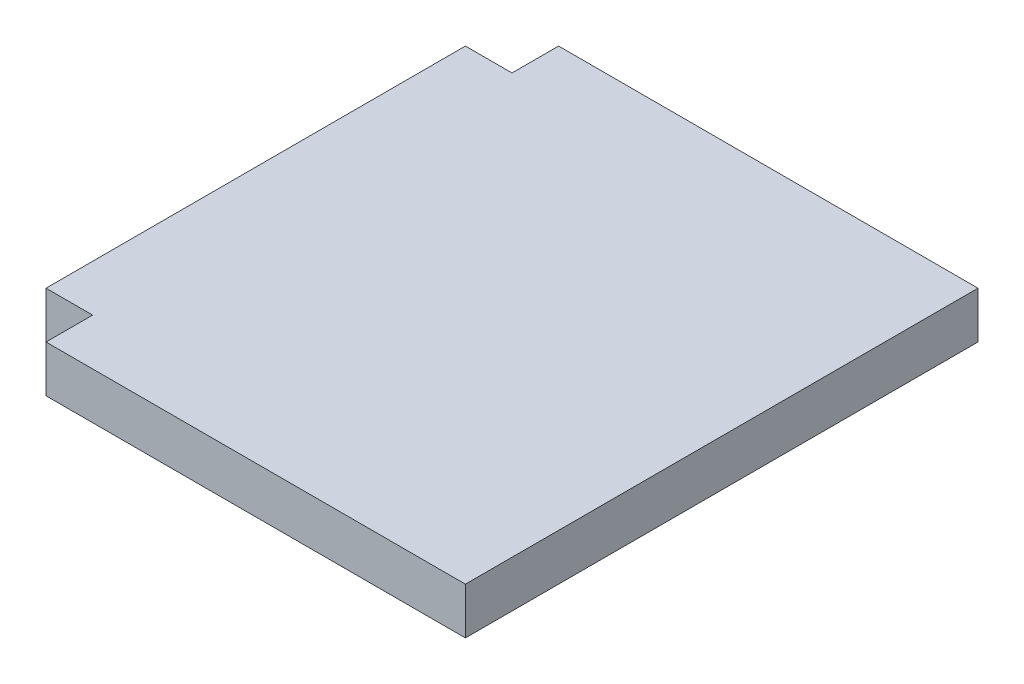
ISO-10303-21;
HEADER;
FILE_DESCRIPTION(('STEP AP214'),'2;1');
FILE_NAME('part.step','',(''),(''),'','','');
FILE_SCHEMA(('AUTOMOTIVE_DESIGN { 1 0 10303 214 1 1 1 1 }'));
ENDSEC;
DATA;
#1=APPLICATION_CONTEXT('core data for automotive mechanical design processes');
#2=APPLICATION_PROTOCOL_DEFINITION('international standard','automotive_design',2000,#1);
#3=PRODUCT_CONTEXT('',#1,'mechanical');
#4=PRODUCT('Part','Part','',(#3));
#5=PRODUCT_RELATED_PRODUCT_CATEGORY('part','',(#4));
#6=PRODUCT_DEFINITION_FORMATION('','',#4);
#7=PRODUCT_DEFINITION_CONTEXT('part definition',#1,'design');
#8=PRODUCT_DEFINITION('design','',#6,#7);
#9=PRODUCT_DEFINITION_SHAPE('','',#8);
#10=(LENGTH_UNIT() NAMED_UNIT(*) SI_UNIT(.MILLI.,.METRE.));
#11=(NAMED_UNIT(*) PLANE_ANGLE_UNIT() SI_UNIT($,.RADIAN.));
#12=(NAMED_UNIT(*) SI_UNIT($,.STERADIAN.) SOLID_ANGLE_UNIT());
#13=UNCERTAINTY_MEASURE_WITH_UNIT(LENGTH_MEASURE(1.E-05),#10,'distance_accuracy_value','');
#14=(GEOMETRIC_REPRESENTATION_CONTEXT(3) GLOBAL_UNCERTAINTY_ASSIGNED_CONTEXT((#13)) GLOBAL_UNIT_ASSIGNED_CONTEXT((#10,
#11,#12)) REPRESENTATION_CONTEXT('',''));
#15=CARTESIAN_POINT('',(0.,0.,0.));
#16=DIRECTION('',(0.,0.,1.));
#17=DIRECTION('',(1.,0.,0.));
#18=AXIS2_PLACEMENT_3D('',#15,#16,#17);
#19=CARTESIAN_POINT('',(250.,50.,-275.));
#20=DIRECTION('',(-1.,0.,0.));
#21=DIRECTION('',(0.,0.,1.));
#22=AXIS2_PLACEMENT_3D('',#19,#20,#21);
#23=PLANE('',#22);
#24=DIRECTION('',(0.,0.,-1.));
#25=VECTOR('',#24,1.);
#26=CARTESIAN_POINT('',(250.,0.,-275.));
#27=LINE('',#26,#25);
#28=CARTESIAN_POINT('',(250.,0.,275.));
#29=VERTEX_POINT('',#28);
#30=CARTESIAN_POINT('',(250.,0.,-275.));
#31=VERTEX_POINT('',#30);
#32=EDGE_CURVE('E154',#29,#31,#27,.T.);
#33=ORIENTED_EDGE('',*,*,#32,.T.);
#34=DIRECTION('',(0.,-1.,0.));
#35=VECTOR('',#34,1.);
#36=CARTESIAN_POINT('',(250.,50.,-275.));
#37=LINE('',#36,#35);
#38=CARTESIAN_POINT('',(250.,50.,-275.));
#39=VERTEX_POINT('',#38);
#40=EDGE_CURVE('E11',#39,#31,#37,.T.);
#41=ORIENTED_EDGE('',*,*,#40,.F.);
#42=DIRECTION('',(0.,0.,-1.));
#43=VECTOR('',#42,1.);
#44=CARTESIAN_POINT('',(250.,50.,-275.));
#45=LINE('',#44,#43);
#46=CARTESIAN_POINT('',(250.,50.,275.));
#47=VERTEX_POINT('',#46);
#48=EDGE_CURVE('E169',#47,#39,#45,.T.);
#49=ORIENTED_EDGE('',*,*,#48,.F.);
#50=DIRECTION('',(0.,-1.,0.));
#51=VECTOR('',#50,1.);
#52=CARTESIAN_POINT('',(250.,50.,275.));
#53=LINE('',#52,#51);
#54=EDGE_CURVE('E57',#47,#29,#53,.T.);
#55=ORIENTED_EDGE('',*,*,#54,.T.);
#56=EDGE_LOOP('',(#33,#41,#49,#55));
#57=FACE_BOUND('',#56,.T.);
#58=ADVANCED_FACE('F49',(#57),#23,.F.);
#59=CARTESIAN_POINT('',(-250.,50.,-275.));
#60=DIRECTION('',(0.,0.,1.));
#61=DIRECTION('',(1.,0.,0.));
#62=AXIS2_PLACEMENT_3D('',#59,#60,#61);
#63=PLANE('',#62);
#64=DIRECTION('',(-1.,0.,0.));
#65=VECTOR('',#64,1.);
#66=CARTESIAN_POINT('',(-250.,0.,-275.));
#67=LINE('',#66,#65);
#68=CARTESIAN_POINT('',(-200.,0.,-275.));
#69=VERTEX_POINT('',#68);
#70=EDGE_CURVE('E186',#31,#69,#67,.T.);
#71=ORIENTED_EDGE('',*,*,#70,.T.);
#72=DIRECTION('',(0.,1.,0.));
#73=VECTOR('',#72,1.);
#74=CARTESIAN_POINT('',(-200.,-70.7106781186548,-275.));
#75=LINE('',#74,#73);
#76=CARTESIAN_POINT('',(-200.,50.,-275.));
#77=VERTEX_POINT('',#76);
#78=EDGE_CURVE('E160',#69,#77,#75,.T.);
#79=ORIENTED_EDGE('',*,*,#78,.T.);
#80=DIRECTION('',(-1.,0.,0.));
#81=VECTOR('',#80,1.);
#82=CARTESIAN_POINT('',(-250.,50.,-275.));
#83=LINE('',#82,#81);
#84=EDGE_CURVE('E173',#39,#77,#83,.T.);
#85=ORIENTED_EDGE('',*,*,#84,.F.);
#86=ORIENTED_EDGE('',*,*,#40,.T.);
#87=EDGE_LOOP('',(#71,#79,#85,#86));
#88=FACE_BOUND('',#87,.T.);
#89=ADVANCED_FACE('F209',(#88),#63,.F.);
#90=CARTESIAN_POINT('',(-250.,50.,-275.));
#91=DIRECTION('',(1.,0.,0.));
#92=DIRECTION('',(0.,0.,-1.));
#93=AXIS2_PLACEMENT_3D('',#90,#91,#92);
#94=PLANE('',#93);
#95=DIRECTION('',(0.,0.,1.));
#96=VECTOR('',#95,1.);
#97=CARTESIAN_POINT('',(-250.,0.,-275.));
#98=LINE('',#97,#96);
#99=CARTESIAN_POINT('',(-250.,0.,-225.));
#100=VERTEX_POINT('',#99);
#101=CARTESIAN_POINT('',(-250.,0.,225.));
#102=VERTEX_POINT('',#101);
#103=EDGE_CURVE('E190',#100,#102,#98,.T.);
#104=ORIENTED_EDGE('',*,*,#103,.T.);
#105=DIRECTION('',(0.,1.,0.));
#106=VECTOR('',#105,1.);
#107=CARTESIAN_POINT('',(-250.,-70.7106781186547,225.));
#108=LINE('',#107,#106);
#109=CARTESIAN_POINT('',(-250.,50.,225.));
#110=VERTEX_POINT('',#109);
#111=EDGE_CURVE('E64',#102,#110,#108,.T.);
#112=ORIENTED_EDGE('',*,*,#111,.T.);
#113=DIRECTION('',(0.,0.,1.));
#114=VECTOR('',#113,1.);
#115=CARTESIAN_POINT('',(-250.,50.,-275.));
#116=LINE('',#115,#114);
#117=CARTESIAN_POINT('',(-250.,50.,-225.));
#118=VERTEX_POINT('',#117);
#119=EDGE_CURVE('E135',#118,#110,#116,.T.);
#120=ORIENTED_EDGE('',*,*,#119,.F.);
#121=DIRECTION('',(0.,1.,0.));
#122=VECTOR('',#121,1.);
#123=CARTESIAN_POINT('',(-250.,-70.7106781186548,-225.));
#124=LINE('',#123,#122);
#125=EDGE_CURVE('E163',#100,#118,#124,.T.);
#126=ORIENTED_EDGE('',*,*,#125,.F.);
#127=EDGE_LOOP('',(#104,#112,#120,#126));
#128=FACE_BOUND('',#127,.T.);
#129=ADVANCED_FACE('F213',(#128),#94,.F.);
#130=CARTESIAN_POINT('',(-250.,50.,275.));
#131=DIRECTION('',(0.,0.,-1.));
#132=DIRECTION('',(-1.,0.,0.));
#133=AXIS2_PLACEMENT_3D('',#130,#131,#132);
#134=PLANE('',#133);
#135=DIRECTION('',(1.,0.,0.));
#136=VECTOR('',#135,1.);
#137=CARTESIAN_POINT('',(-250.,50.,275.));
#138=LINE('',#137,#136);
#139=CARTESIAN_POINT('',(-200.,50.,275.));
#140=VERTEX_POINT('',#139);
#141=EDGE_CURVE('E180',#140,#47,#138,.T.);
#142=ORIENTED_EDGE('',*,*,#141,.F.);
#143=DIRECTION('',(0.,1.,0.));
#144=VECTOR('',#143,1.);
#145=CARTESIAN_POINT('',(-200.,-70.7106781186547,275.));
#146=LINE('',#145,#144);
#147=CARTESIAN_POINT('',(-200.,0.,275.));
#148=VERTEX_POINT('',#147);
#149=EDGE_CURVE('E126',#148,#140,#146,.T.);
#150=ORIENTED_EDGE('',*,*,#149,.F.);
#151=DIRECTION('',(1.,0.,0.));
#152=VECTOR('',#151,1.);
#153=CARTESIAN_POINT('',(-250.,0.,275.));
#154=LINE('',#153,#152);
#155=EDGE_CURVE('E174',#148,#29,#154,.T.);
#156=ORIENTED_EDGE('',*,*,#155,.T.);
#157=ORIENTED_EDGE('',*,*,#54,.F.);
#158=EDGE_LOOP('',(#142,#150,#156,#157));
#159=FACE_BOUND('',#158,.T.);
#160=ADVANCED_FACE('F211',(#159),#134,.F.);
#161=CARTESIAN_POINT('',(0.,50.,0.));
#162=DIRECTION('',(0.,1.,0.));
#163=DIRECTION('',(0.,0.,1.));
#164=AXIS2_PLACEMENT_3D('',#161,#162,#163);
#165=PLANE('',#164);
#166=DIRECTION('',(0.,0.,-1.));
#167=VECTOR('',#166,1.);
#168=CARTESIAN_POINT('',(-200.,50.,225.));
#169=LINE('',#168,#167);
#170=CARTESIAN_POINT('',(-200.,50.,225.));
#171=VERTEX_POINT('',#170);
#172=EDGE_CURVE('E123',#140,#171,#169,.T.);
#173=ORIENTED_EDGE('',*,*,#172,.F.);
#174=ORIENTED_EDGE('',*,*,#141,.T.);
#175=ORIENTED_EDGE('',*,*,#48,.T.);
#176=ORIENTED_EDGE('',*,*,#84,.T.);
#177=DIRECTION('',(0.,0.,-1.));
#178=VECTOR('',#177,1.);
#179=CARTESIAN_POINT('',(-200.,50.,-275.));
#180=LINE('',#179,#178);
#181=CARTESIAN_POINT('',(-200.,50.,-225.));
#182=VERTEX_POINT('',#181);
#183=EDGE_CURVE('E147',#182,#77,#180,.T.);
#184=ORIENTED_EDGE('',*,*,#183,.F.);
#185=DIRECTION('',(1.,0.,0.));
#186=VECTOR('',#185,1.);
#187=CARTESIAN_POINT('',(-250.,50.,-225.));
#188=LINE('',#187,#186);
#189=EDGE_CURVE('E157',#118,#182,#188,.T.);
#190=ORIENTED_EDGE('',*,*,#189,.F.);
#191=ORIENTED_EDGE('',*,*,#119,.T.);
#192=DIRECTION('',(-1.,0.,0.));
#193=VECTOR('',#192,1.);
#194=CARTESIAN_POINT('',(-250.,50.,225.));
#195=LINE('',#194,#193);
#196=EDGE_CURVE('E116',#171,#110,#195,.T.);
#197=ORIENTED_EDGE('',*,*,#196,.F.);
#198=EDGE_LOOP('',(#173,#174,#175,#176,#184,#190,#191,#197));
#199=FACE_BOUND('',#198,.T.);
#200=ADVANCED_FACE('F132',(#199),#165,.T.);
#201=CARTESIAN_POINT('',(0.,0.,0.));
#202=DIRECTION('',(0.,1.,0.));
#203=DIRECTION('',(0.,0.,1.));
#204=AXIS2_PLACEMENT_3D('',#201,#202,#203);
#205=PLANE('',#204);
#206=ORIENTED_EDGE('',*,*,#155,.F.);
#207=DIRECTION('',(0.,0.,1.));
#208=VECTOR('',#207,1.);
#209=CARTESIAN_POINT('',(-200.,0.,225.));
#210=LINE('',#209,#208);
#211=CARTESIAN_POINT('',(-200.,0.,225.));
#212=VERTEX_POINT('',#211);
#213=EDGE_CURVE('E142',#212,#148,#210,.T.);
#214=ORIENTED_EDGE('',*,*,#213,.F.);
#215=DIRECTION('',(1.,0.,0.));
#216=VECTOR('',#215,1.);
#217=CARTESIAN_POINT('',(-250.,0.,225.));
#218=LINE('',#217,#216);
#219=EDGE_CURVE('E117',#102,#212,#218,.T.);
#220=ORIENTED_EDGE('',*,*,#219,.F.);
#221=ORIENTED_EDGE('',*,*,#103,.F.);
#222=DIRECTION('',(-1.,0.,0.));
#223=VECTOR('',#222,1.);
#224=CARTESIAN_POINT('',(-250.,0.,-225.));
#225=LINE('',#224,#223);
#226=CARTESIAN_POINT('',(-200.,0.,-225.));
#227=VERTEX_POINT('',#226);
#228=EDGE_CURVE('E148',#227,#100,#225,.T.);
#229=ORIENTED_EDGE('',*,*,#228,.F.);
#230=DIRECTION('',(0.,0.,1.));
#231=VECTOR('',#230,1.);
#232=CARTESIAN_POINT('',(-200.,0.,-275.));
#233=LINE('',#232,#231);
#234=EDGE_CURVE('E151',#69,#227,#233,.T.);
#235=ORIENTED_EDGE('',*,*,#234,.F.);
#236=ORIENTED_EDGE('',*,*,#70,.F.);
#237=ORIENTED_EDGE('',*,*,#32,.F.);
#238=EDGE_LOOP('',(#206,#214,#220,#221,#229,#235,#236,#237));
#239=FACE_BOUND('',#238,.T.);
#240=ADVANCED_FACE('F205',(#239),#205,.F.);
#241=CARTESIAN_POINT('',(-200.,-70.7106781186548,-275.));
#242=DIRECTION('',(1.,0.,0.));
#243=DIRECTION('',(0.,0.,-1.));
#244=AXIS2_PLACEMENT_3D('',#241,#242,#243);
#245=PLANE('',#244);
#246=ORIENTED_EDGE('',*,*,#234,.T.);
#247=DIRECTION('',(0.,1.,0.));
#248=VECTOR('',#247,1.);
#249=CARTESIAN_POINT('',(-200.,-70.7106781186548,-225.));
#250=LINE('',#249,#248);
#251=EDGE_CURVE('E72',#227,#182,#250,.T.);
#252=ORIENTED_EDGE('',*,*,#251,.T.);
#253=ORIENTED_EDGE('',*,*,#183,.T.);
#254=ORIENTED_EDGE('',*,*,#78,.F.);
#255=EDGE_LOOP('',(#246,#252,#253,#254));
#256=FACE_BOUND('',#255,.T.);
#257=ADVANCED_FACE('F252',(#256),#245,.F.);
#258=CARTESIAN_POINT('',(-250.,-70.7106781186548,-225.));
#259=DIRECTION('',(0.,0.,1.));
#260=DIRECTION('',(1.,0.,0.));
#261=AXIS2_PLACEMENT_3D('',#258,#259,#260);
#262=PLANE('',#261);
#263=ORIENTED_EDGE('',*,*,#228,.T.);
#264=ORIENTED_EDGE('',*,*,#125,.T.);
#265=ORIENTED_EDGE('',*,*,#189,.T.);
#266=ORIENTED_EDGE('',*,*,#251,.F.);
#267=EDGE_LOOP('',(#263,#264,#265,#266));
#268=FACE_BOUND('',#267,.T.);
#269=ADVANCED_FACE('F264',(#268),#262,.F.);
#270=CARTESIAN_POINT('',(-200.,-70.7106781186547,225.));
#271=DIRECTION('',(1.,0.,0.));
#272=DIRECTION('',(0.,0.,-1.));
#273=AXIS2_PLACEMENT_3D('',#270,#271,#272);
#274=PLANE('',#273);
#275=ORIENTED_EDGE('',*,*,#213,.T.);
#276=ORIENTED_EDGE('',*,*,#149,.T.);
#277=ORIENTED_EDGE('',*,*,#172,.T.);
#278=DIRECTION('',(0.,1.,0.));
#279=VECTOR('',#278,1.);
#280=CARTESIAN_POINT('',(-200.,-70.7106781186547,225.));
#281=LINE('',#280,#279);
#282=EDGE_CURVE('E112',#212,#171,#281,.T.);
#283=ORIENTED_EDGE('',*,*,#282,.F.);
#284=EDGE_LOOP('',(#275,#276,#277,#283));
#285=FACE_BOUND('',#284,.T.);
#286=ADVANCED_FACE('F124',(#285),#274,.F.);
#287=CARTESIAN_POINT('',(-250.,-70.7106781186547,225.));
#288=DIRECTION('',(0.,0.,-1.));
#289=DIRECTION('',(-1.,0.,0.));
#290=AXIS2_PLACEMENT_3D('',#287,#288,#289);
#291=PLANE('',#290);
#292=ORIENTED_EDGE('',*,*,#219,.T.);
#293=ORIENTED_EDGE('',*,*,#282,.T.);
#294=ORIENTED_EDGE('',*,*,#196,.T.);
#295=ORIENTED_EDGE('',*,*,#111,.F.);
#296=EDGE_LOOP('',(#292,#293,#294,#295));
#297=FACE_BOUND('',#296,.T.);
#298=ADVANCED_FACE('F114',(#297),#291,.F.);
#299=CLOSED_SHELL('',(#58,#89,#129,#160,#200,#240,#257,#269,#286,#298));
#300=MANIFOLD_SOLID_BREP('B2',#299);
#301=ADVANCED_BREP_SHAPE_REPRESENTATION('',(#18,#300),#14);
#302=SHAPE_DEFINITION_REPRESENTATION(#9,#301);
ENDSEC;
END-ISO-10303-21;
